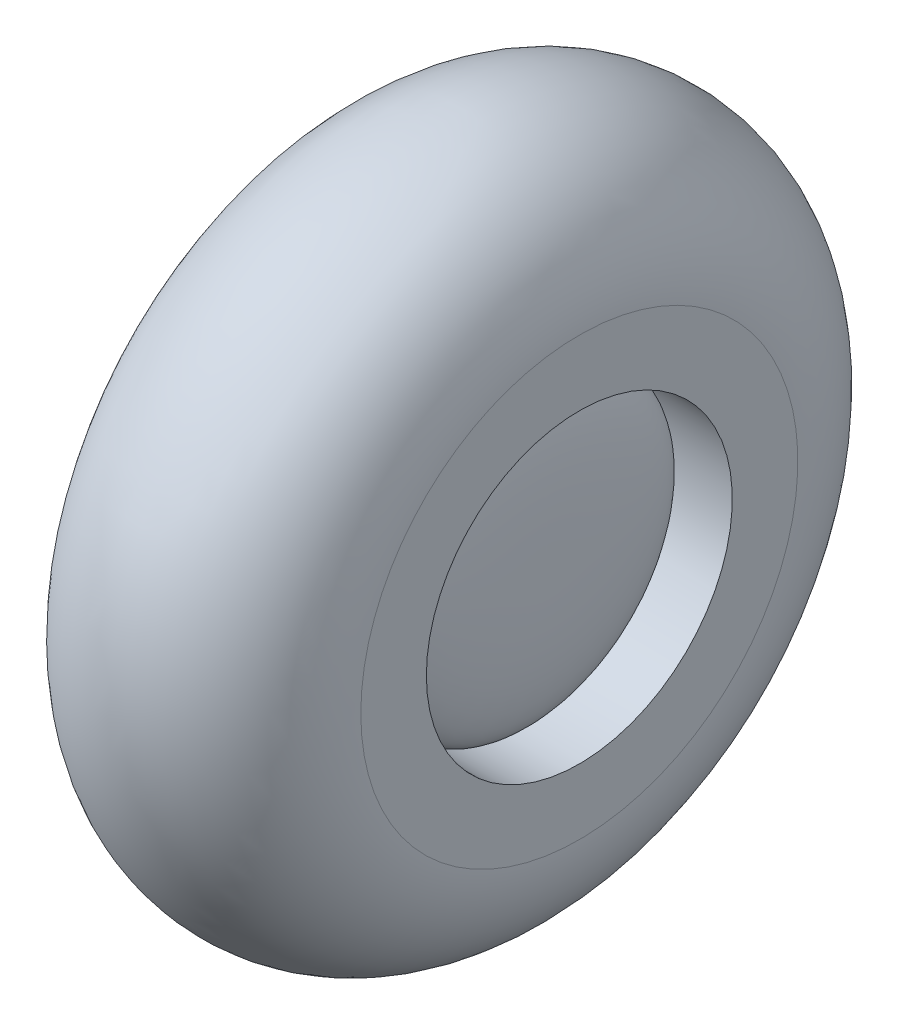
ISO-10303-21;
HEADER;
FILE_DESCRIPTION(('STEP AP214'),'2;1');
FILE_NAME('part.step','',(''),(''),'','','');
FILE_SCHEMA(('AUTOMOTIVE_DESIGN { 1 0 10303 214 1 1 1 1 }'));
ENDSEC;
DATA;
#1=APPLICATION_CONTEXT('core data for automotive mechanical design processes');
#2=APPLICATION_PROTOCOL_DEFINITION('international standard','automotive_design',2000,#1);
#3=PRODUCT_CONTEXT('',#1,'mechanical');
#4=PRODUCT('Part','Part','',(#3));
#5=PRODUCT_RELATED_PRODUCT_CATEGORY('part','',(#4));
#6=PRODUCT_DEFINITION_FORMATION('','',#4);
#7=PRODUCT_DEFINITION_CONTEXT('part definition',#1,'design');
#8=PRODUCT_DEFINITION('design','',#6,#7);
#9=PRODUCT_DEFINITION_SHAPE('','',#8);
#10=(LENGTH_UNIT() NAMED_UNIT(*) SI_UNIT(.MILLI.,.METRE.));
#11=(NAMED_UNIT(*) PLANE_ANGLE_UNIT() SI_UNIT($,.RADIAN.));
#12=(NAMED_UNIT(*) SI_UNIT($,.STERADIAN.) SOLID_ANGLE_UNIT());
#13=UNCERTAINTY_MEASURE_WITH_UNIT(LENGTH_MEASURE(1.E-05),#10,'distance_accuracy_value','');
#14=(GEOMETRIC_REPRESENTATION_CONTEXT(3) GLOBAL_UNCERTAINTY_ASSIGNED_CONTEXT((#13)) GLOBAL_UNIT_ASSIGNED_CONTEXT((#10,
#11,#12)) REPRESENTATION_CONTEXT('',''));
#15=CARTESIAN_POINT('',(0.,0.,0.));
#16=DIRECTION('',(0.,0.,1.));
#17=DIRECTION('',(1.,0.,0.));
#18=AXIS2_PLACEMENT_3D('',#15,#16,#17);
#19=CARTESIAN_POINT('',(66.675,0.,0.));
#20=CARTESIAN_POINT('',(66.675,43.6827159275501,0.));
#21=CARTESIAN_POINT('',(66.9029837296915,104.4575,0.));
#22=CARTESIAN_POINT('',(44.45,104.4575,0.));
#23=B_SPLINE_CURVE_WITH_KNOTS('',3,(#19,#20,#21,#22),.UNSPECIFIED.,.F.,.F.,(4,4),(0.,1.),.UNSPECIFIED.);
#24=CARTESIAN_POINT('',(0.,0.,0.));
#25=DIRECTION('',(-1.,0.,0.));
#26=AXIS1_PLACEMENT('',#24,#25);
#27=SURFACE_OF_REVOLUTION('',#23,#26);
#28=CARTESIAN_POINT('',(44.45,0.,0.));
#29=DIRECTION('',(-1.,0.,0.));
#30=DIRECTION('',(0.,0.,1.));
#31=AXIS2_PLACEMENT_3D('',#28,#29,#30);
#32=CIRCLE('',#31,104.4575);
#33=CARTESIAN_POINT('',(44.45,0.,104.4575));
#34=VERTEX_POINT('',#33);
#35=EDGE_CURVE('E13',#34,#34,#32,.T.);
#36=ORIENTED_EDGE('',*,*,#35,.F.);
#37=EDGE_LOOP('',(#36));
#38=FACE_BOUND('',#37,.T.);
#39=CARTESIAN_POINT('',(66.675,0.,0.));
#40=VERTEX_POINT('',#39);
#41=VERTEX_LOOP('',#40);
#42=FACE_BOUND('',#41,.T.);
#43=ADVANCED_FACE('F47',(#38,#42),#27,.T.);
#44=CARTESIAN_POINT('',(0.,0.,0.));
#45=DIRECTION('',(-1.,0.,0.));
#46=DIRECTION('',(0.,0.,1.));
#47=AXIS2_PLACEMENT_3D('',#44,#45,#46);
#48=CYLINDRICAL_SURFACE('',#47,104.4575);
#49=CARTESIAN_POINT('',(88.9,0.,0.));
#50=DIRECTION('',(-1.,0.,0.));
#51=DIRECTION('',(0.,0.,1.));
#52=AXIS2_PLACEMENT_3D('',#49,#50,#51);
#53=CIRCLE('',#52,104.4575);
#54=CARTESIAN_POINT('',(88.9,0.,104.4575));
#55=VERTEX_POINT('',#54);
#56=EDGE_CURVE('E55',#55,#55,#53,.T.);
#57=ORIENTED_EDGE('',*,*,#56,.F.);
#58=EDGE_LOOP('',(#57));
#59=FACE_BOUND('',#58,.T.);
#60=ORIENTED_EDGE('',*,*,#35,.T.);
#61=EDGE_LOOP('',(#60));
#62=FACE_BOUND('',#61,.T.);
#63=ADVANCED_FACE('F89',(#59,#62),#48,.F.);
#64=CARTESIAN_POINT('',(88.9,104.4575,0.));
#65=DIRECTION('',(-1.,0.,0.));
#66=DIRECTION('',(0.,0.,1.));
#67=AXIS2_PLACEMENT_3D('',#64,#65,#66);
#68=PLANE('',#67);
#69=CARTESIAN_POINT('',(88.9,0.,0.));
#70=DIRECTION('',(-1.,0.,0.));
#71=DIRECTION('',(0.,0.,1.));
#72=AXIS2_PLACEMENT_3D('',#69,#70,#71);
#73=CIRCLE('',#72,149.225);
#74=CARTESIAN_POINT('',(88.9,0.,149.225));
#75=VERTEX_POINT('',#74);
#76=EDGE_CURVE('E82',#75,#75,#73,.T.);
#77=ORIENTED_EDGE('',*,*,#76,.F.);
#78=EDGE_LOOP('',(#77));
#79=FACE_BOUND('',#78,.T.);
#80=ORIENTED_EDGE('',*,*,#56,.T.);
#81=EDGE_LOOP('',(#80));
#82=FACE_BOUND('',#81,.T.);
#83=ADVANCED_FACE('F87',(#79,#82),#68,.F.);
#84=CARTESIAN_POINT('',(0.,0.,0.));
#85=DIRECTION('',(-1.,0.,0.));
#86=DIRECTION('',(0.,0.,1.));
#87=AXIS2_PLACEMENT_3D('',#84,#85,#86);
#88=TOROIDAL_SURFACE('',#87,149.225,88.9);
#89=CARTESIAN_POINT('',(-88.9,0.,0.));
#90=DIRECTION('',(-1.,0.,0.));
#91=DIRECTION('',(0.,0.,1.));
#92=AXIS2_PLACEMENT_3D('',#89,#90,#91);
#93=CIRCLE('',#92,149.225);
#94=CARTESIAN_POINT('',(-88.9,0.,149.225));
#95=VERTEX_POINT('',#94);
#96=EDGE_CURVE('E73',#95,#95,#93,.T.);
#97=ORIENTED_EDGE('',*,*,#96,.F.);
#98=EDGE_LOOP('',(#97));
#99=FACE_BOUND('',#98,.T.);
#100=ORIENTED_EDGE('',*,*,#76,.T.);
#101=EDGE_LOOP('',(#100));
#102=FACE_BOUND('',#101,.T.);
#103=ADVANCED_FACE('F108',(#99,#102),#88,.T.);
#104=CARTESIAN_POINT('',(-88.9,104.4575,0.));
#105=DIRECTION('',(1.,0.,0.));
#106=DIRECTION('',(0.,0.,-1.));
#107=AXIS2_PLACEMENT_3D('',#104,#105,#106);
#108=PLANE('',#107);
#109=CARTESIAN_POINT('',(-88.9,0.,0.));
#110=DIRECTION('',(-1.,0.,0.));
#111=DIRECTION('',(0.,0.,1.));
#112=AXIS2_PLACEMENT_3D('',#109,#110,#111);
#113=CIRCLE('',#112,104.4575);
#114=CARTESIAN_POINT('',(-88.9,0.,104.4575));
#115=VERTEX_POINT('',#114);
#116=EDGE_CURVE('E70',#115,#115,#113,.T.);
#117=ORIENTED_EDGE('',*,*,#116,.F.);
#118=EDGE_LOOP('',(#117));
#119=FACE_BOUND('',#118,.T.);
#120=ORIENTED_EDGE('',*,*,#96,.T.);
#121=EDGE_LOOP('',(#120));
#122=FACE_BOUND('',#121,.T.);
#123=ADVANCED_FACE('F116',(#119,#122),#108,.F.);
#124=CARTESIAN_POINT('',(0.,0.,0.));
#125=DIRECTION('',(-1.,0.,0.));
#126=DIRECTION('',(0.,0.,1.));
#127=AXIS2_PLACEMENT_3D('',#124,#125,#126);
#128=CYLINDRICAL_SURFACE('',#127,104.4575);
#129=CARTESIAN_POINT('',(-44.45,0.,0.));
#130=DIRECTION('',(-1.,0.,0.));
#131=DIRECTION('',(0.,0.,1.));
#132=AXIS2_PLACEMENT_3D('',#129,#130,#131);
#133=CIRCLE('',#132,104.4575);
#134=CARTESIAN_POINT('',(-44.45,0.,104.4575));
#135=VERTEX_POINT('',#134);
#136=EDGE_CURVE('E68',#135,#135,#133,.T.);
#137=ORIENTED_EDGE('',*,*,#136,.F.);
#138=EDGE_LOOP('',(#137));
#139=FACE_BOUND('',#138,.T.);
#140=ORIENTED_EDGE('',*,*,#116,.T.);
#141=EDGE_LOOP('',(#140));
#142=FACE_BOUND('',#141,.T.);
#143=ADVANCED_FACE('F64',(#139,#142),#128,.F.);
#144=CARTESIAN_POINT('',(-44.45,104.4575,0.));
#145=CARTESIAN_POINT('',(-66.9029837296915,104.4575,0.));
#146=CARTESIAN_POINT('',(-66.675,43.6827159275501,0.));
#147=CARTESIAN_POINT('',(-66.675,0.,0.));
#148=B_SPLINE_CURVE_WITH_KNOTS('',3,(#144,#145,#146,#147),.UNSPECIFIED.,.F.,.F.,(4,4),(0.,1.),.UNSPECIFIED.);
#149=CARTESIAN_POINT('',(0.,0.,0.));
#150=DIRECTION('',(-1.,0.,0.));
#151=AXIS1_PLACEMENT('',#149,#150);
#152=SURFACE_OF_REVOLUTION('',#148,#151);
#153=CARTESIAN_POINT('',(-66.675,0.,0.));
#154=VERTEX_POINT('',#153);
#155=VERTEX_LOOP('',#154);
#156=FACE_BOUND('',#155,.T.);
#157=ORIENTED_EDGE('',*,*,#136,.T.);
#158=EDGE_LOOP('',(#157));
#159=FACE_BOUND('',#158,.T.);
#160=ADVANCED_FACE('F61',(#156,#159),#152,.T.);
#161=CLOSED_SHELL('',(#43,#63,#83,#103,#123,#143,#160));
#162=MANIFOLD_SOLID_BREP('B2',#161);
#163=ADVANCED_BREP_SHAPE_REPRESENTATION('',(#18,#162),#14);
#164=SHAPE_DEFINITION_REPRESENTATION(#9,#163);
ENDSEC;
END-ISO-10303-21;
